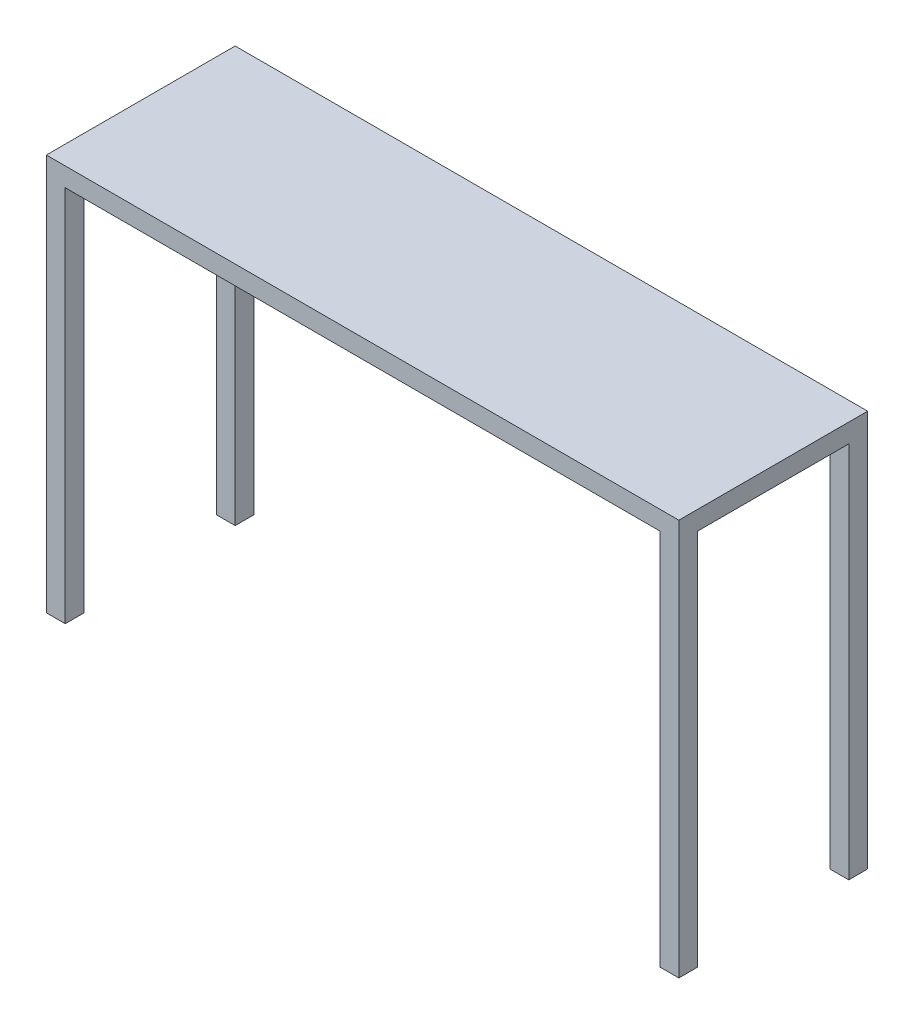
ISO-10303-21;
HEADER;
FILE_DESCRIPTION(('STEP AP214'),'2;1');
FILE_NAME('part.step','',(''),(''),'','','');
FILE_SCHEMA(('AUTOMOTIVE_DESIGN { 1 0 10303 214 1 1 1 1 }'));
ENDSEC;
DATA;
#1=APPLICATION_CONTEXT('core data for automotive mechanical design processes');
#2=APPLICATION_PROTOCOL_DEFINITION('international standard','automotive_design',2000,#1);
#3=PRODUCT_CONTEXT('',#1,'mechanical');
#4=PRODUCT('Part','Part','',(#3));
#5=PRODUCT_RELATED_PRODUCT_CATEGORY('part','',(#4));
#6=PRODUCT_DEFINITION_FORMATION('','',#4);
#7=PRODUCT_DEFINITION_CONTEXT('part definition',#1,'design');
#8=PRODUCT_DEFINITION('design','',#6,#7);
#9=PRODUCT_DEFINITION_SHAPE('','',#8);
#10=(LENGTH_UNIT() NAMED_UNIT(*) SI_UNIT(.MILLI.,.METRE.));
#11=(NAMED_UNIT(*) PLANE_ANGLE_UNIT() SI_UNIT($,.RADIAN.));
#12=(NAMED_UNIT(*) SI_UNIT($,.STERADIAN.) SOLID_ANGLE_UNIT());
#13=UNCERTAINTY_MEASURE_WITH_UNIT(LENGTH_MEASURE(1.E-05),#10,'distance_accuracy_value','');
#14=(GEOMETRIC_REPRESENTATION_CONTEXT(3) GLOBAL_UNCERTAINTY_ASSIGNED_CONTEXT((#13)) GLOBAL_UNIT_ASSIGNED_CONTEXT((#10,
#11,#12)) REPRESENTATION_CONTEXT('',''));
#15=CARTESIAN_POINT('',(0.,0.,0.));
#16=DIRECTION('',(0.,0.,1.));
#17=DIRECTION('',(1.,0.,0.));
#18=AXIS2_PLACEMENT_3D('',#15,#16,#17);
#19=CARTESIAN_POINT('',(0.,0.,0.));
#20=DIRECTION('',(0.,1.,0.));
#21=DIRECTION('',(0.,0.,1.));
#22=AXIS2_PLACEMENT_3D('',#19,#20,#21);
#23=PLANE('',#22);
#24=DIRECTION('',(-1.,0.,0.));
#25=VECTOR('',#24,1.);
#26=CARTESIAN_POINT('',(850.9,0.,-203.2));
#27=LINE('',#26,#25);
#28=CARTESIAN_POINT('',(850.9,0.,-203.2));
#29=VERTEX_POINT('',#28);
#30=CARTESIAN_POINT('',(800.1,0.,-203.2));
#31=VERTEX_POINT('',#30);
#32=EDGE_CURVE('E309',#29,#31,#27,.T.);
#33=ORIENTED_EDGE('',*,*,#32,.F.);
#34=DIRECTION('',(0.,0.,-1.));
#35=VECTOR('',#34,1.);
#36=CARTESIAN_POINT('',(850.9,0.,-254.));
#37=LINE('',#36,#35);
#38=CARTESIAN_POINT('',(850.9,0.,203.2));
#39=VERTEX_POINT('',#38);
#40=EDGE_CURVE('E169',#39,#29,#37,.T.);
#41=ORIENTED_EDGE('',*,*,#40,.F.);
#42=DIRECTION('',(1.,0.,0.));
#43=VECTOR('',#42,1.);
#44=CARTESIAN_POINT('',(850.9,0.,203.2));
#45=LINE('',#44,#43);
#46=CARTESIAN_POINT('',(800.1,0.,203.2));
#47=VERTEX_POINT('',#46);
#48=EDGE_CURVE('E172',#47,#39,#45,.T.);
#49=ORIENTED_EDGE('',*,*,#48,.F.);
#50=DIRECTION('',(0.,0.,-1.));
#51=VECTOR('',#50,1.);
#52=CARTESIAN_POINT('',(800.1,0.,254.));
#53=LINE('',#52,#51);
#54=CARTESIAN_POINT('',(800.1,0.,254.));
#55=VERTEX_POINT('',#54);
#56=EDGE_CURVE('E170',#55,#47,#53,.T.);
#57=ORIENTED_EDGE('',*,*,#56,.F.);
#58=DIRECTION('',(1.,0.,0.));
#59=VECTOR('',#58,1.);
#60=CARTESIAN_POINT('',(-850.9,0.,254.));
#61=LINE('',#60,#59);
#62=CARTESIAN_POINT('',(-800.1,0.,254.));
#63=VERTEX_POINT('',#62);
#64=EDGE_CURVE('E243',#63,#55,#61,.T.);
#65=ORIENTED_EDGE('',*,*,#64,.F.);
#66=DIRECTION('',(0.,0.,1.));
#67=VECTOR('',#66,1.);
#68=CARTESIAN_POINT('',(-800.1,0.,254.));
#69=LINE('',#68,#67);
#70=CARTESIAN_POINT('',(-800.1,0.,203.2));
#71=VERTEX_POINT('',#70);
#72=EDGE_CURVE('E219',#71,#63,#69,.T.);
#73=ORIENTED_EDGE('',*,*,#72,.F.);
#74=DIRECTION('',(1.,0.,0.));
#75=VECTOR('',#74,1.);
#76=CARTESIAN_POINT('',(-850.9,0.,203.2));
#77=LINE('',#76,#75);
#78=CARTESIAN_POINT('',(-850.9,0.,203.2));
#79=VERTEX_POINT('',#78);
#80=EDGE_CURVE('E214',#79,#71,#77,.T.);
#81=ORIENTED_EDGE('',*,*,#80,.F.);
#82=DIRECTION('',(0.,0.,1.));
#83=VECTOR('',#82,1.);
#84=CARTESIAN_POINT('',(-850.9,0.,-254.));
#85=LINE('',#84,#83);
#86=CARTESIAN_POINT('',(-850.9,0.,-203.2));
#87=VERTEX_POINT('',#86);
#88=EDGE_CURVE('E253',#87,#79,#85,.T.);
#89=ORIENTED_EDGE('',*,*,#88,.F.);
#90=DIRECTION('',(-1.,0.,0.));
#91=VECTOR('',#90,1.);
#92=CARTESIAN_POINT('',(-850.9,0.,-203.2));
#93=LINE('',#92,#91);
#94=CARTESIAN_POINT('',(-800.1,0.,-203.2));
#95=VERTEX_POINT('',#94);
#96=EDGE_CURVE('E199',#95,#87,#93,.T.);
#97=ORIENTED_EDGE('',*,*,#96,.F.);
#98=DIRECTION('',(0.,0.,1.));
#99=VECTOR('',#98,1.);
#100=CARTESIAN_POINT('',(-800.1,0.,-254.));
#101=LINE('',#100,#99);
#102=CARTESIAN_POINT('',(-800.1,0.,-254.));
#103=VERTEX_POINT('',#102);
#104=EDGE_CURVE('E194',#103,#95,#101,.T.);
#105=ORIENTED_EDGE('',*,*,#104,.F.);
#106=DIRECTION('',(-1.,0.,0.));
#107=VECTOR('',#106,1.);
#108=CARTESIAN_POINT('',(-850.9,0.,-254.));
#109=LINE('',#108,#107);
#110=CARTESIAN_POINT('',(800.1,0.,-254.));
#111=VERTEX_POINT('',#110);
#112=EDGE_CURVE('E251',#111,#103,#109,.T.);
#113=ORIENTED_EDGE('',*,*,#112,.F.);
#114=DIRECTION('',(0.,0.,-1.));
#115=VECTOR('',#114,1.);
#116=CARTESIAN_POINT('',(800.1,0.,-254.));
#117=LINE('',#116,#115);
#118=EDGE_CURVE('E164',#31,#111,#117,.T.);
#119=ORIENTED_EDGE('',*,*,#118,.F.);
#120=EDGE_LOOP('',(#33,#41,#49,#57,#65,#73,#81,#89,#97,#105,#113,#119));
#121=FACE_BOUND('',#120,.T.);
#122=ADVANCED_FACE('F32',(#121),#23,.F.);
#123=CARTESIAN_POINT('',(850.9,50.8,-254.));
#124=DIRECTION('',(-1.,0.,0.));
#125=DIRECTION('',(0.,0.,1.));
#126=AXIS2_PLACEMENT_3D('',#123,#124,#125);
#127=PLANE('',#126);
#128=DIRECTION('',(0.,-1.,0.));
#129=VECTOR('',#128,1.);
#130=CARTESIAN_POINT('',(850.9,50.8,254.));
#131=LINE('',#130,#129);
#132=CARTESIAN_POINT('',(850.9,50.8,254.));
#133=VERTEX_POINT('',#132);
#134=CARTESIAN_POINT('',(850.9,-1016.,254.));
#135=VERTEX_POINT('',#134);
#136=EDGE_CURVE('E249',#133,#135,#131,.T.);
#137=ORIENTED_EDGE('',*,*,#136,.T.);
#138=DIRECTION('',(0.,0.,1.));
#139=VECTOR('',#138,1.);
#140=CARTESIAN_POINT('',(850.9,-1016.,254.));
#141=LINE('',#140,#139);
#142=CARTESIAN_POINT('',(850.9,-1016.,203.2));
#143=VERTEX_POINT('',#142);
#144=EDGE_CURVE('E177',#143,#135,#141,.T.);
#145=ORIENTED_EDGE('',*,*,#144,.F.);
#146=DIRECTION('',(0.,1.,0.));
#147=VECTOR('',#146,1.);
#148=CARTESIAN_POINT('',(850.9,-1016.,203.2));
#149=LINE('',#148,#147);
#150=EDGE_CURVE('E185',#143,#39,#149,.T.);
#151=ORIENTED_EDGE('',*,*,#150,.T.);
#152=ORIENTED_EDGE('',*,*,#40,.T.);
#153=DIRECTION('',(0.,1.,0.));
#154=VECTOR('',#153,1.);
#155=CARTESIAN_POINT('',(850.9,-1016.,-203.2));
#156=LINE('',#155,#154);
#157=CARTESIAN_POINT('',(850.9,-1016.,-203.2));
#158=VERTEX_POINT('',#157);
#159=EDGE_CURVE('E149',#158,#29,#156,.T.);
#160=ORIENTED_EDGE('',*,*,#159,.F.);
#161=DIRECTION('',(0.,0.,1.));
#162=VECTOR('',#161,1.);
#163=CARTESIAN_POINT('',(850.9,-1016.,-254.));
#164=LINE('',#163,#162);
#165=CARTESIAN_POINT('',(850.9,-1016.,-254.));
#166=VERTEX_POINT('',#165);
#167=EDGE_CURVE('E156',#166,#158,#164,.T.);
#168=ORIENTED_EDGE('',*,*,#167,.F.);
#169=DIRECTION('',(0.,-1.,0.));
#170=VECTOR('',#169,1.);
#171=CARTESIAN_POINT('',(850.9,50.8,-254.));
#172=LINE('',#171,#170);
#173=CARTESIAN_POINT('',(850.9,50.8,-254.));
#174=VERTEX_POINT('',#173);
#175=EDGE_CURVE('E11',#174,#166,#172,.T.);
#176=ORIENTED_EDGE('',*,*,#175,.F.);
#177=DIRECTION('',(0.,0.,-1.));
#178=VECTOR('',#177,1.);
#179=CARTESIAN_POINT('',(850.9,50.8,-254.));
#180=LINE('',#179,#178);
#181=EDGE_CURVE('E239',#133,#174,#180,.T.);
#182=ORIENTED_EDGE('',*,*,#181,.F.);
#183=EDGE_LOOP('',(#137,#145,#151,#152,#160,#168,#176,#182));
#184=FACE_BOUND('',#183,.T.);
#185=ADVANCED_FACE('F34',(#184),#127,.F.);
#186=CARTESIAN_POINT('',(-850.9,50.8,-254.));
#187=DIRECTION('',(0.,0.,1.));
#188=DIRECTION('',(1.,0.,0.));
#189=AXIS2_PLACEMENT_3D('',#186,#187,#188);
#190=PLANE('',#189);
#191=ORIENTED_EDGE('',*,*,#175,.T.);
#192=DIRECTION('',(1.,0.,0.));
#193=VECTOR('',#192,1.);
#194=CARTESIAN_POINT('',(850.9,-1016.,-254.));
#195=LINE('',#194,#193);
#196=CARTESIAN_POINT('',(800.1,-1016.,-254.));
#197=VERTEX_POINT('',#196);
#198=EDGE_CURVE('E161',#197,#166,#195,.T.);
#199=ORIENTED_EDGE('',*,*,#198,.F.);
#200=DIRECTION('',(0.,1.,0.));
#201=VECTOR('',#200,1.);
#202=CARTESIAN_POINT('',(800.1,-1016.,-254.));
#203=LINE('',#202,#201);
#204=EDGE_CURVE('E47',#197,#111,#203,.T.);
#205=ORIENTED_EDGE('',*,*,#204,.T.);
#206=ORIENTED_EDGE('',*,*,#112,.T.);
#207=DIRECTION('',(0.,1.,0.));
#208=VECTOR('',#207,1.);
#209=CARTESIAN_POINT('',(-800.1,-1016.,-254.));
#210=LINE('',#209,#208);
#211=CARTESIAN_POINT('',(-800.1,-1016.,-254.));
#212=VERTEX_POINT('',#211);
#213=EDGE_CURVE('E211',#212,#103,#210,.T.);
#214=ORIENTED_EDGE('',*,*,#213,.F.);
#215=DIRECTION('',(1.,0.,0.));
#216=VECTOR('',#215,1.);
#217=CARTESIAN_POINT('',(-850.9,-1016.,-254.));
#218=LINE('',#217,#216);
#219=CARTESIAN_POINT('',(-850.9,-1016.,-254.));
#220=VERTEX_POINT('',#219);
#221=EDGE_CURVE('E198',#220,#212,#218,.T.);
#222=ORIENTED_EDGE('',*,*,#221,.F.);
#223=DIRECTION('',(0.,-1.,0.));
#224=VECTOR('',#223,1.);
#225=CARTESIAN_POINT('',(-850.9,50.8,-254.));
#226=LINE('',#225,#224);
#227=CARTESIAN_POINT('',(-850.9,50.8,-254.));
#228=VERTEX_POINT('',#227);
#229=EDGE_CURVE('E40',#228,#220,#226,.T.);
#230=ORIENTED_EDGE('',*,*,#229,.F.);
#231=DIRECTION('',(-1.,0.,0.));
#232=VECTOR('',#231,1.);
#233=CARTESIAN_POINT('',(-850.9,50.8,-254.));
#234=LINE('',#233,#232);
#235=EDGE_CURVE('E242',#174,#228,#234,.T.);
#236=ORIENTED_EDGE('',*,*,#235,.F.);
#237=EDGE_LOOP('',(#191,#199,#205,#206,#214,#222,#230,#236));
#238=FACE_BOUND('',#237,.T.);
#239=ADVANCED_FACE('F265',(#238),#190,.F.);
#240=CARTESIAN_POINT('',(-850.9,50.8,-254.));
#241=DIRECTION('',(1.,0.,0.));
#242=DIRECTION('',(0.,0.,-1.));
#243=AXIS2_PLACEMENT_3D('',#240,#241,#242);
#244=PLANE('',#243);
#245=ORIENTED_EDGE('',*,*,#229,.T.);
#246=DIRECTION('',(0.,0.,-1.));
#247=VECTOR('',#246,1.);
#248=CARTESIAN_POINT('',(-850.9,-1016.,-254.));
#249=LINE('',#248,#247);
#250=CARTESIAN_POINT('',(-850.9,-1016.,-203.2));
#251=VERTEX_POINT('',#250);
#252=EDGE_CURVE('E195',#251,#220,#249,.T.);
#253=ORIENTED_EDGE('',*,*,#252,.F.);
#254=DIRECTION('',(0.,1.,0.));
#255=VECTOR('',#254,1.);
#256=CARTESIAN_POINT('',(-850.9,-1016.,-203.2));
#257=LINE('',#256,#255);
#258=EDGE_CURVE('E55',#251,#87,#257,.T.);
#259=ORIENTED_EDGE('',*,*,#258,.T.);
#260=ORIENTED_EDGE('',*,*,#88,.T.);
#261=DIRECTION('',(0.,1.,0.));
#262=VECTOR('',#261,1.);
#263=CARTESIAN_POINT('',(-850.9,-1016.,203.2));
#264=LINE('',#263,#262);
#265=CARTESIAN_POINT('',(-850.9,-1016.,203.2));
#266=VERTEX_POINT('',#265);
#267=EDGE_CURVE('E236',#266,#79,#264,.T.);
#268=ORIENTED_EDGE('',*,*,#267,.F.);
#269=DIRECTION('',(0.,0.,-1.));
#270=VECTOR('',#269,1.);
#271=CARTESIAN_POINT('',(-850.9,-1016.,254.));
#272=LINE('',#271,#270);
#273=CARTESIAN_POINT('',(-850.9,-1016.,254.));
#274=VERTEX_POINT('',#273);
#275=EDGE_CURVE('E215',#274,#266,#272,.T.);
#276=ORIENTED_EDGE('',*,*,#275,.F.);
#277=DIRECTION('',(0.,-1.,0.));
#278=VECTOR('',#277,1.);
#279=CARTESIAN_POINT('',(-850.9,50.8,254.));
#280=LINE('',#279,#278);
#281=CARTESIAN_POINT('',(-850.9,50.8,254.));
#282=VERTEX_POINT('',#281);
#283=EDGE_CURVE('E258',#282,#274,#280,.T.);
#284=ORIENTED_EDGE('',*,*,#283,.F.);
#285=DIRECTION('',(0.,0.,1.));
#286=VECTOR('',#285,1.);
#287=CARTESIAN_POINT('',(-850.9,50.8,-254.));
#288=LINE('',#287,#286);
#289=EDGE_CURVE('E245',#228,#282,#288,.T.);
#290=ORIENTED_EDGE('',*,*,#289,.F.);
#291=EDGE_LOOP('',(#245,#253,#259,#260,#268,#276,#284,#290));
#292=FACE_BOUND('',#291,.T.);
#293=ADVANCED_FACE('F262',(#292),#244,.F.);
#294=CARTESIAN_POINT('',(-850.9,50.8,254.));
#295=DIRECTION('',(0.,0.,-1.));
#296=DIRECTION('',(-1.,0.,0.));
#297=AXIS2_PLACEMENT_3D('',#294,#295,#296);
#298=PLANE('',#297);
#299=ORIENTED_EDGE('',*,*,#283,.T.);
#300=DIRECTION('',(-1.,0.,0.));
#301=VECTOR('',#300,1.);
#302=CARTESIAN_POINT('',(-850.9,-1016.,254.));
#303=LINE('',#302,#301);
#304=CARTESIAN_POINT('',(-800.1,-1016.,254.));
#305=VERTEX_POINT('',#304);
#306=EDGE_CURVE('E223',#305,#274,#303,.T.);
#307=ORIENTED_EDGE('',*,*,#306,.F.);
#308=DIRECTION('',(0.,1.,0.));
#309=VECTOR('',#308,1.);
#310=CARTESIAN_POINT('',(-800.1,-1016.,254.));
#311=LINE('',#310,#309);
#312=EDGE_CURVE('E226',#305,#63,#311,.T.);
#313=ORIENTED_EDGE('',*,*,#312,.T.);
#314=ORIENTED_EDGE('',*,*,#64,.T.);
#315=DIRECTION('',(0.,1.,0.));
#316=VECTOR('',#315,1.);
#317=CARTESIAN_POINT('',(800.1,-1016.,254.));
#318=LINE('',#317,#316);
#319=CARTESIAN_POINT('',(800.1,-1016.,254.));
#320=VERTEX_POINT('',#319);
#321=EDGE_CURVE('E192',#320,#55,#318,.T.);
#322=ORIENTED_EDGE('',*,*,#321,.F.);
#323=DIRECTION('',(-1.,0.,0.));
#324=VECTOR('',#323,1.);
#325=CARTESIAN_POINT('',(850.9,-1016.,254.));
#326=LINE('',#325,#324);
#327=EDGE_CURVE('E180',#135,#320,#326,.T.);
#328=ORIENTED_EDGE('',*,*,#327,.F.);
#329=ORIENTED_EDGE('',*,*,#136,.F.);
#330=DIRECTION('',(1.,0.,0.));
#331=VECTOR('',#330,1.);
#332=CARTESIAN_POINT('',(-850.9,50.8,254.));
#333=LINE('',#332,#331);
#334=EDGE_CURVE('E247',#282,#133,#333,.T.);
#335=ORIENTED_EDGE('',*,*,#334,.F.);
#336=EDGE_LOOP('',(#299,#307,#313,#314,#322,#328,#329,#335));
#337=FACE_BOUND('',#336,.T.);
#338=ADVANCED_FACE('F289',(#337),#298,.F.);
#339=CARTESIAN_POINT('',(0.,50.8,0.));
#340=DIRECTION('',(0.,1.,0.));
#341=DIRECTION('',(0.,0.,1.));
#342=AXIS2_PLACEMENT_3D('',#339,#340,#341);
#343=PLANE('',#342);
#344=ORIENTED_EDGE('',*,*,#181,.T.);
#345=ORIENTED_EDGE('',*,*,#235,.T.);
#346=ORIENTED_EDGE('',*,*,#289,.T.);
#347=ORIENTED_EDGE('',*,*,#334,.T.);
#348=EDGE_LOOP('',(#344,#345,#346,#347));
#349=FACE_BOUND('',#348,.T.);
#350=ADVANCED_FACE('F295',(#349),#343,.T.);
#351=CARTESIAN_POINT('',(-850.9,-1016.,203.2));
#352=DIRECTION('',(0.,0.,1.));
#353=DIRECTION('',(1.,0.,0.));
#354=AXIS2_PLACEMENT_3D('',#351,#352,#353);
#355=PLANE('',#354);
#356=ORIENTED_EDGE('',*,*,#80,.T.);
#357=DIRECTION('',(0.,1.,0.));
#358=VECTOR('',#357,1.);
#359=CARTESIAN_POINT('',(-800.1,-1016.,203.2));
#360=LINE('',#359,#358);
#361=CARTESIAN_POINT('',(-800.1,-1016.,203.2));
#362=VERTEX_POINT('',#361);
#363=EDGE_CURVE('E233',#362,#71,#360,.T.);
#364=ORIENTED_EDGE('',*,*,#363,.F.);
#365=DIRECTION('',(1.,0.,0.));
#366=VECTOR('',#365,1.);
#367=CARTESIAN_POINT('',(-850.9,-1016.,203.2));
#368=LINE('',#367,#366);
#369=EDGE_CURVE('E218',#266,#362,#368,.T.);
#370=ORIENTED_EDGE('',*,*,#369,.F.);
#371=ORIENTED_EDGE('',*,*,#267,.T.);
#372=EDGE_LOOP('',(#356,#364,#370,#371));
#373=FACE_BOUND('',#372,.T.);
#374=ADVANCED_FACE('F281',(#373),#355,.F.);
#375=CARTESIAN_POINT('',(-800.1,-1016.,254.));
#376=DIRECTION('',(-1.,0.,0.));
#377=DIRECTION('',(0.,0.,1.));
#378=AXIS2_PLACEMENT_3D('',#375,#376,#377);
#379=PLANE('',#378);
#380=ORIENTED_EDGE('',*,*,#72,.T.);
#381=ORIENTED_EDGE('',*,*,#312,.F.);
#382=DIRECTION('',(0.,0.,1.));
#383=VECTOR('',#382,1.);
#384=CARTESIAN_POINT('',(-800.1,-1016.,254.));
#385=LINE('',#384,#383);
#386=EDGE_CURVE('E221',#362,#305,#385,.T.);
#387=ORIENTED_EDGE('',*,*,#386,.F.);
#388=ORIENTED_EDGE('',*,*,#363,.T.);
#389=EDGE_LOOP('',(#380,#381,#387,#388));
#390=FACE_BOUND('',#389,.T.);
#391=ADVANCED_FACE('F326',(#390),#379,.F.);
#392=CARTESIAN_POINT('',(0.,-1016.,0.));
#393=DIRECTION('',(0.,-1.,0.));
#394=DIRECTION('',(0.,0.,-1.));
#395=AXIS2_PLACEMENT_3D('',#392,#393,#394);
#396=PLANE('',#395);
#397=ORIENTED_EDGE('',*,*,#275,.T.);
#398=ORIENTED_EDGE('',*,*,#369,.T.);
#399=ORIENTED_EDGE('',*,*,#386,.T.);
#400=ORIENTED_EDGE('',*,*,#306,.T.);
#401=EDGE_LOOP('',(#397,#398,#399,#400));
#402=FACE_BOUND('',#401,.T.);
#403=ADVANCED_FACE('F285',(#402),#396,.T.);
#404=CARTESIAN_POINT('',(-800.1,-1016.,-254.));
#405=DIRECTION('',(-1.,0.,0.));
#406=DIRECTION('',(0.,0.,1.));
#407=AXIS2_PLACEMENT_3D('',#404,#405,#406);
#408=PLANE('',#407);
#409=ORIENTED_EDGE('',*,*,#104,.T.);
#410=DIRECTION('',(0.,1.,0.));
#411=VECTOR('',#410,1.);
#412=CARTESIAN_POINT('',(-800.1,-1016.,-203.2));
#413=LINE('',#412,#411);
#414=CARTESIAN_POINT('',(-800.1,-1016.,-203.2));
#415=VERTEX_POINT('',#414);
#416=EDGE_CURVE('E208',#415,#95,#413,.T.);
#417=ORIENTED_EDGE('',*,*,#416,.F.);
#418=DIRECTION('',(0.,0.,1.));
#419=VECTOR('',#418,1.);
#420=CARTESIAN_POINT('',(-800.1,-1016.,-254.));
#421=LINE('',#420,#419);
#422=EDGE_CURVE('E201',#212,#415,#421,.T.);
#423=ORIENTED_EDGE('',*,*,#422,.F.);
#424=ORIENTED_EDGE('',*,*,#213,.T.);
#425=EDGE_LOOP('',(#409,#417,#423,#424));
#426=FACE_BOUND('',#425,.T.);
#427=ADVANCED_FACE('F318',(#426),#408,.F.);
#428=CARTESIAN_POINT('',(-850.9,-1016.,-203.2));
#429=DIRECTION('',(0.,0.,-1.));
#430=DIRECTION('',(-1.,0.,0.));
#431=AXIS2_PLACEMENT_3D('',#428,#429,#430);
#432=PLANE('',#431);
#433=ORIENTED_EDGE('',*,*,#96,.T.);
#434=ORIENTED_EDGE('',*,*,#258,.F.);
#435=DIRECTION('',(-1.,0.,0.));
#436=VECTOR('',#435,1.);
#437=CARTESIAN_POINT('',(-850.9,-1016.,-203.2));
#438=LINE('',#437,#436);
#439=EDGE_CURVE('E203',#415,#251,#438,.T.);
#440=ORIENTED_EDGE('',*,*,#439,.F.);
#441=ORIENTED_EDGE('',*,*,#416,.T.);
#442=EDGE_LOOP('',(#433,#434,#440,#441));
#443=FACE_BOUND('',#442,.T.);
#444=ADVANCED_FACE('F272',(#443),#432,.F.);
#445=CARTESIAN_POINT('',(0.,-1016.,0.));
#446=DIRECTION('',(0.,1.,0.));
#447=DIRECTION('',(0.,0.,1.));
#448=AXIS2_PLACEMENT_3D('',#445,#446,#447);
#449=PLANE('',#448);
#450=ORIENTED_EDGE('',*,*,#252,.T.);
#451=ORIENTED_EDGE('',*,*,#221,.T.);
#452=ORIENTED_EDGE('',*,*,#422,.T.);
#453=ORIENTED_EDGE('',*,*,#439,.T.);
#454=EDGE_LOOP('',(#450,#451,#452,#453));
#455=FACE_BOUND('',#454,.T.);
#456=ADVANCED_FACE('F268',(#455),#449,.F.);
#457=CARTESIAN_POINT('',(800.1,-1016.,254.));
#458=DIRECTION('',(1.,0.,0.));
#459=DIRECTION('',(0.,0.,-1.));
#460=AXIS2_PLACEMENT_3D('',#457,#458,#459);
#461=PLANE('',#460);
#462=ORIENTED_EDGE('',*,*,#56,.T.);
#463=DIRECTION('',(0.,1.,0.));
#464=VECTOR('',#463,1.);
#465=CARTESIAN_POINT('',(800.1,-1016.,203.2));
#466=LINE('',#465,#464);
#467=CARTESIAN_POINT('',(800.1,-1016.,203.2));
#468=VERTEX_POINT('',#467);
#469=EDGE_CURVE('E189',#468,#47,#466,.T.);
#470=ORIENTED_EDGE('',*,*,#469,.F.);
#471=DIRECTION('',(0.,0.,-1.));
#472=VECTOR('',#471,1.);
#473=CARTESIAN_POINT('',(800.1,-1016.,254.));
#474=LINE('',#473,#472);
#475=EDGE_CURVE('E182',#320,#468,#474,.T.);
#476=ORIENTED_EDGE('',*,*,#475,.F.);
#477=ORIENTED_EDGE('',*,*,#321,.T.);
#478=EDGE_LOOP('',(#462,#470,#476,#477));
#479=FACE_BOUND('',#478,.T.);
#480=ADVANCED_FACE('F392',(#479),#461,.F.);
#481=CARTESIAN_POINT('',(850.9,-1016.,203.2));
#482=DIRECTION('',(0.,0.,1.));
#483=DIRECTION('',(1.,0.,0.));
#484=AXIS2_PLACEMENT_3D('',#481,#482,#483);
#485=PLANE('',#484);
#486=ORIENTED_EDGE('',*,*,#48,.T.);
#487=ORIENTED_EDGE('',*,*,#150,.F.);
#488=DIRECTION('',(1.,0.,0.));
#489=VECTOR('',#488,1.);
#490=CARTESIAN_POINT('',(850.9,-1016.,203.2));
#491=LINE('',#490,#489);
#492=EDGE_CURVE('E184',#468,#143,#491,.T.);
#493=ORIENTED_EDGE('',*,*,#492,.F.);
#494=ORIENTED_EDGE('',*,*,#469,.T.);
#495=EDGE_LOOP('',(#486,#487,#493,#494));
#496=FACE_BOUND('',#495,.T.);
#497=ADVANCED_FACE('F305',(#496),#485,.F.);
#498=CARTESIAN_POINT('',(0.,-1016.,0.));
#499=DIRECTION('',(0.,1.,0.));
#500=DIRECTION('',(0.,0.,1.));
#501=AXIS2_PLACEMENT_3D('',#498,#499,#500);
#502=PLANE('',#501);
#503=ORIENTED_EDGE('',*,*,#144,.T.);
#504=ORIENTED_EDGE('',*,*,#327,.T.);
#505=ORIENTED_EDGE('',*,*,#475,.T.);
#506=ORIENTED_EDGE('',*,*,#492,.T.);
#507=EDGE_LOOP('',(#503,#504,#505,#506));
#508=FACE_BOUND('',#507,.T.);
#509=ADVANCED_FACE('F300',(#508),#502,.F.);
#510=CARTESIAN_POINT('',(850.9,-1016.,-203.2));
#511=DIRECTION('',(0.,0.,-1.));
#512=DIRECTION('',(-1.,0.,0.));
#513=AXIS2_PLACEMENT_3D('',#510,#511,#512);
#514=PLANE('',#513);
#515=ORIENTED_EDGE('',*,*,#32,.T.);
#516=DIRECTION('',(0.,1.,0.));
#517=VECTOR('',#516,1.);
#518=CARTESIAN_POINT('',(800.1,-1016.,-203.2));
#519=LINE('',#518,#517);
#520=CARTESIAN_POINT('',(800.1,-1016.,-203.2));
#521=VERTEX_POINT('',#520);
#522=EDGE_CURVE('E152',#521,#31,#519,.T.);
#523=ORIENTED_EDGE('',*,*,#522,.F.);
#524=DIRECTION('',(-1.,0.,0.));
#525=VECTOR('',#524,1.);
#526=CARTESIAN_POINT('',(850.9,-1016.,-203.2));
#527=LINE('',#526,#525);
#528=EDGE_CURVE('E145',#158,#521,#527,.T.);
#529=ORIENTED_EDGE('',*,*,#528,.F.);
#530=ORIENTED_EDGE('',*,*,#159,.T.);
#531=EDGE_LOOP('',(#515,#523,#529,#530));
#532=FACE_BOUND('',#531,.T.);
#533=ADVANCED_FACE('F147',(#532),#514,.F.);
#534=CARTESIAN_POINT('',(800.1,-1016.,-254.));
#535=DIRECTION('',(1.,0.,0.));
#536=DIRECTION('',(0.,0.,-1.));
#537=AXIS2_PLACEMENT_3D('',#534,#535,#536);
#538=PLANE('',#537);
#539=ORIENTED_EDGE('',*,*,#118,.T.);
#540=ORIENTED_EDGE('',*,*,#204,.F.);
#541=DIRECTION('',(0.,0.,-1.));
#542=VECTOR('',#541,1.);
#543=CARTESIAN_POINT('',(800.1,-1016.,-254.));
#544=LINE('',#543,#542);
#545=EDGE_CURVE('E155',#521,#197,#544,.T.);
#546=ORIENTED_EDGE('',*,*,#545,.F.);
#547=ORIENTED_EDGE('',*,*,#522,.T.);
#548=EDGE_LOOP('',(#539,#540,#546,#547));
#549=FACE_BOUND('',#548,.T.);
#550=ADVANCED_FACE('F316',(#549),#538,.F.);
#551=CARTESIAN_POINT('',(0.,-1016.,0.));
#552=DIRECTION('',(0.,-1.,0.));
#553=DIRECTION('',(0.,0.,-1.));
#554=AXIS2_PLACEMENT_3D('',#551,#552,#553);
#555=PLANE('',#554);
#556=ORIENTED_EDGE('',*,*,#167,.T.);
#557=ORIENTED_EDGE('',*,*,#528,.T.);
#558=ORIENTED_EDGE('',*,*,#545,.T.);
#559=ORIENTED_EDGE('',*,*,#198,.T.);
#560=EDGE_LOOP('',(#556,#557,#558,#559));
#561=FACE_BOUND('',#560,.T.);
#562=ADVANCED_FACE('F160',(#561),#555,.T.);
#563=CLOSED_SHELL('',(#122,#185,#239,#293,#338,#350,#374,#391,#403,#427,#444,#456,#480,#497,
#509,#533,#550,#562));
#564=MANIFOLD_SOLID_BREP('B2',#563);
#565=ADVANCED_BREP_SHAPE_REPRESENTATION('',(#18,#564),#14);
#566=SHAPE_DEFINITION_REPRESENTATION(#9,#565);
ENDSEC;
END-ISO-10303-21;
